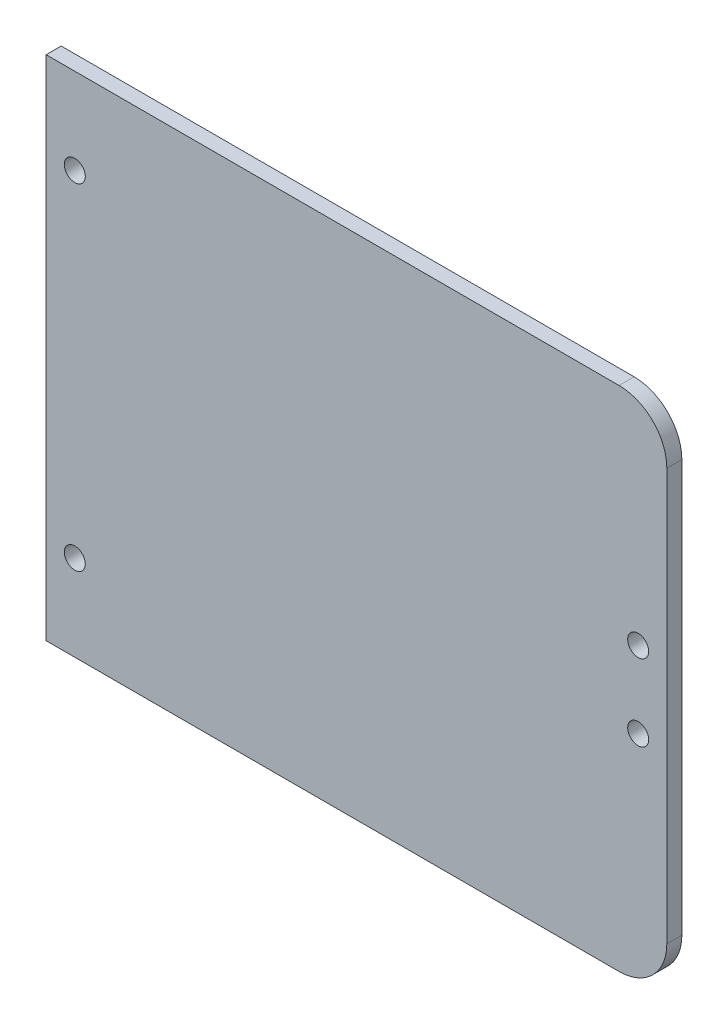
ISO-10303-21;
HEADER;
FILE_DESCRIPTION(('STEP AP214'),'2;1');
FILE_NAME('part.step','',(''),(''),'','','');
FILE_SCHEMA(('AUTOMOTIVE_DESIGN { 1 0 10303 214 1 1 1 1 }'));
ENDSEC;
DATA;
#1=APPLICATION_CONTEXT('core data for automotive mechanical design processes');
#2=APPLICATION_PROTOCOL_DEFINITION('international standard','automotive_design',2000,#1);
#3=PRODUCT_CONTEXT('',#1,'mechanical');
#4=PRODUCT('Part','Part','',(#3));
#5=PRODUCT_RELATED_PRODUCT_CATEGORY('part','',(#4));
#6=PRODUCT_DEFINITION_FORMATION('','',#4);
#7=PRODUCT_DEFINITION_CONTEXT('part definition',#1,'design');
#8=PRODUCT_DEFINITION('design','',#6,#7);
#9=PRODUCT_DEFINITION_SHAPE('','',#8);
#10=(LENGTH_UNIT() NAMED_UNIT(*) SI_UNIT(.MILLI.,.METRE.));
#11=(NAMED_UNIT(*) PLANE_ANGLE_UNIT() SI_UNIT($,.RADIAN.));
#12=(NAMED_UNIT(*) SI_UNIT($,.STERADIAN.) SOLID_ANGLE_UNIT());
#13=UNCERTAINTY_MEASURE_WITH_UNIT(LENGTH_MEASURE(1.E-05),#10,'distance_accuracy_value','');
#14=(GEOMETRIC_REPRESENTATION_CONTEXT(3) GLOBAL_UNCERTAINTY_ASSIGNED_CONTEXT((#13)) GLOBAL_UNIT_ASSIGNED_CONTEXT((#10,
#11,#12)) REPRESENTATION_CONTEXT('',''));
#15=CARTESIAN_POINT('',(0.,0.,0.));
#16=DIRECTION('',(0.,0.,1.));
#17=DIRECTION('',(1.,0.,0.));
#18=AXIS2_PLACEMENT_3D('',#15,#16,#17);
#19=CARTESIAN_POINT('',(60.,-5.,-1.5748));
#20=DIRECTION('',(0.,0.,1.));
#21=DIRECTION('',(1.,0.,0.));
#22=AXIS2_PLACEMENT_3D('',#19,#20,#21);
#23=CYLINDRICAL_SURFACE('',#22,5.);
#24=CARTESIAN_POINT('',(60.,-5.,0.));
#25=DIRECTION('',(0.,0.,1.));
#26=DIRECTION('',(1.,0.,0.));
#27=AXIS2_PLACEMENT_3D('',#24,#25,#26);
#28=CIRCLE('',#27,5.);
#29=CARTESIAN_POINT('',(65.,-5.,0.));
#30=VERTEX_POINT('',#29);
#31=CARTESIAN_POINT('',(60.,0.,0.));
#32=VERTEX_POINT('',#31);
#33=EDGE_CURVE('E117',#30,#32,#28,.T.);
#34=ORIENTED_EDGE('',*,*,#33,.F.);
#35=DIRECTION('',(0.,0.,1.));
#36=VECTOR('',#35,1.);
#37=CARTESIAN_POINT('',(65.,-5.,-1.5748));
#38=LINE('',#37,#36);
#39=CARTESIAN_POINT('',(65.,-5.,-1.5748));
#40=VERTEX_POINT('',#39);
#41=EDGE_CURVE('E11',#40,#30,#38,.T.);
#42=ORIENTED_EDGE('',*,*,#41,.F.);
#43=CARTESIAN_POINT('',(60.,-5.,-1.5748));
#44=DIRECTION('',(0.,0.,1.));
#45=DIRECTION('',(1.,0.,0.));
#46=AXIS2_PLACEMENT_3D('',#43,#44,#45);
#47=CIRCLE('',#46,5.);
#48=CARTESIAN_POINT('',(60.,0.,-1.5748));
#49=VERTEX_POINT('',#48);
#50=EDGE_CURVE('E132',#40,#49,#47,.T.);
#51=ORIENTED_EDGE('',*,*,#50,.T.);
#52=DIRECTION('',(0.,0.,1.));
#53=VECTOR('',#52,1.);
#54=CARTESIAN_POINT('',(60.,0.,-1.5748));
#55=LINE('',#54,#53);
#56=EDGE_CURVE('E35',#49,#32,#55,.T.);
#57=ORIENTED_EDGE('',*,*,#56,.T.);
#58=EDGE_LOOP('',(#34,#42,#51,#57));
#59=FACE_BOUND('',#58,.T.);
#60=ADVANCED_FACE('F32',(#59),#23,.T.);
#61=CARTESIAN_POINT('',(65.,-5.,-1.5748));
#62=DIRECTION('',(1.,0.,0.));
#63=DIRECTION('',(0.,0.,-1.));
#64=AXIS2_PLACEMENT_3D('',#61,#62,#63);
#65=PLANE('',#64);
#66=DIRECTION('',(0.,1.,0.));
#67=VECTOR('',#66,1.);
#68=CARTESIAN_POINT('',(65.,-5.,0.));
#69=LINE('',#68,#67);
#70=CARTESIAN_POINT('',(65.,-48.15,0.));
#71=VERTEX_POINT('',#70);
#72=EDGE_CURVE('E130',#71,#30,#69,.T.);
#73=ORIENTED_EDGE('',*,*,#72,.F.);
#74=DIRECTION('',(0.,0.,1.));
#75=VECTOR('',#74,1.);
#76=CARTESIAN_POINT('',(65.,-48.15,-1.5748));
#77=LINE('',#76,#75);
#78=CARTESIAN_POINT('',(65.,-48.15,-1.5748));
#79=VERTEX_POINT('',#78);
#80=EDGE_CURVE('E41',#79,#71,#77,.T.);
#81=ORIENTED_EDGE('',*,*,#80,.F.);
#82=DIRECTION('',(0.,1.,0.));
#83=VECTOR('',#82,1.);
#84=CARTESIAN_POINT('',(65.,-5.,-1.5748));
#85=LINE('',#84,#83);
#86=EDGE_CURVE('E107',#79,#40,#85,.T.);
#87=ORIENTED_EDGE('',*,*,#86,.T.);
#88=ORIENTED_EDGE('',*,*,#41,.T.);
#89=EDGE_LOOP('',(#73,#81,#87,#88));
#90=FACE_BOUND('',#89,.T.);
#91=ADVANCED_FACE('F140',(#90),#65,.T.);
#92=CARTESIAN_POINT('',(60.,-48.15,-1.5748));
#93=DIRECTION('',(0.,0.,1.));
#94=DIRECTION('',(1.,0.,0.));
#95=AXIS2_PLACEMENT_3D('',#92,#93,#94);
#96=CYLINDRICAL_SURFACE('',#95,5.);
#97=CARTESIAN_POINT('',(60.,-48.15,0.));
#98=DIRECTION('',(0.,0.,1.));
#99=DIRECTION('',(1.,0.,0.));
#100=AXIS2_PLACEMENT_3D('',#97,#98,#99);
#101=CIRCLE('',#100,5.);
#102=CARTESIAN_POINT('',(60.,-53.15,0.));
#103=VERTEX_POINT('',#102);
#104=EDGE_CURVE('E94',#103,#71,#101,.T.);
#105=ORIENTED_EDGE('',*,*,#104,.F.);
#106=DIRECTION('',(0.,0.,1.));
#107=VECTOR('',#106,1.);
#108=CARTESIAN_POINT('',(60.,-53.15,-1.5748));
#109=LINE('',#108,#107);
#110=CARTESIAN_POINT('',(60.,-53.15,-1.5748));
#111=VERTEX_POINT('',#110);
#112=EDGE_CURVE('E89',#111,#103,#109,.T.);
#113=ORIENTED_EDGE('',*,*,#112,.F.);
#114=CARTESIAN_POINT('',(60.,-48.15,-1.5748));
#115=DIRECTION('',(0.,0.,1.));
#116=DIRECTION('',(1.,0.,0.));
#117=AXIS2_PLACEMENT_3D('',#114,#115,#116);
#118=CIRCLE('',#117,5.);
#119=EDGE_CURVE('E92',#111,#79,#118,.T.);
#120=ORIENTED_EDGE('',*,*,#119,.T.);
#121=ORIENTED_EDGE('',*,*,#80,.T.);
#122=EDGE_LOOP('',(#105,#113,#120,#121));
#123=FACE_BOUND('',#122,.T.);
#124=ADVANCED_FACE('F91',(#123),#96,.T.);
#125=CARTESIAN_POINT('',(60.,-53.15,-1.5748));
#126=DIRECTION('',(0.,-1.,0.));
#127=DIRECTION('',(0.,0.,-1.));
#128=AXIS2_PLACEMENT_3D('',#125,#126,#127);
#129=PLANE('',#128);
#130=DIRECTION('',(1.,0.,0.));
#131=VECTOR('',#130,1.);
#132=CARTESIAN_POINT('',(60.,-53.15,0.));
#133=LINE('',#132,#131);
#134=CARTESIAN_POINT('',(0.,-53.15,0.));
#135=VERTEX_POINT('',#134);
#136=EDGE_CURVE('E127',#135,#103,#133,.T.);
#137=ORIENTED_EDGE('',*,*,#136,.F.);
#138=DIRECTION('',(0.,0.,1.));
#139=VECTOR('',#138,1.);
#140=CARTESIAN_POINT('',(0.,-53.15,-1.5748));
#141=LINE('',#140,#139);
#142=CARTESIAN_POINT('',(0.,-53.15,-1.5748));
#143=VERTEX_POINT('',#142);
#144=EDGE_CURVE('E99',#143,#135,#141,.T.);
#145=ORIENTED_EDGE('',*,*,#144,.F.);
#146=DIRECTION('',(1.,0.,0.));
#147=VECTOR('',#146,1.);
#148=CARTESIAN_POINT('',(60.,-53.15,-1.5748));
#149=LINE('',#148,#147);
#150=EDGE_CURVE('E105',#143,#111,#149,.T.);
#151=ORIENTED_EDGE('',*,*,#150,.T.);
#152=ORIENTED_EDGE('',*,*,#112,.T.);
#153=EDGE_LOOP('',(#137,#145,#151,#152));
#154=FACE_BOUND('',#153,.T.);
#155=ADVANCED_FACE('F109',(#154),#129,.T.);
#156=CARTESIAN_POINT('',(0.,-53.15,-1.5748));
#157=DIRECTION('',(-1.,0.,0.));
#158=DIRECTION('',(0.,0.,1.));
#159=AXIS2_PLACEMENT_3D('',#156,#157,#158);
#160=PLANE('',#159);
#161=DIRECTION('',(0.,-1.,0.));
#162=VECTOR('',#161,1.);
#163=CARTESIAN_POINT('',(0.,-53.15,0.));
#164=LINE('',#163,#162);
#165=CARTESIAN_POINT('',(0.,0.,0.));
#166=VERTEX_POINT('',#165);
#167=EDGE_CURVE('E124',#166,#135,#164,.T.);
#168=ORIENTED_EDGE('',*,*,#167,.F.);
#169=DIRECTION('',(0.,0.,1.));
#170=VECTOR('',#169,1.);
#171=CARTESIAN_POINT('',(0.,0.,-1.5748));
#172=LINE('',#171,#170);
#173=CARTESIAN_POINT('',(0.,0.,-1.5748));
#174=VERTEX_POINT('',#173);
#175=EDGE_CURVE('E135',#174,#166,#172,.T.);
#176=ORIENTED_EDGE('',*,*,#175,.F.);
#177=DIRECTION('',(0.,-1.,0.));
#178=VECTOR('',#177,1.);
#179=CARTESIAN_POINT('',(0.,-53.15,-1.5748));
#180=LINE('',#179,#178);
#181=EDGE_CURVE('E110',#174,#143,#180,.T.);
#182=ORIENTED_EDGE('',*,*,#181,.T.);
#183=ORIENTED_EDGE('',*,*,#144,.T.);
#184=EDGE_LOOP('',(#168,#176,#182,#183));
#185=FACE_BOUND('',#184,.T.);
#186=ADVANCED_FACE('F153',(#185),#160,.T.);
#187=CARTESIAN_POINT('',(0.,0.,-1.5748));
#188=DIRECTION('',(0.,1.,0.));
#189=DIRECTION('',(0.,0.,1.));
#190=AXIS2_PLACEMENT_3D('',#187,#188,#189);
#191=PLANE('',#190);
#192=DIRECTION('',(-1.,0.,0.));
#193=VECTOR('',#192,1.);
#194=CARTESIAN_POINT('',(0.,0.,0.));
#195=LINE('',#194,#193);
#196=EDGE_CURVE('E120',#32,#166,#195,.T.);
#197=ORIENTED_EDGE('',*,*,#196,.F.);
#198=ORIENTED_EDGE('',*,*,#56,.F.);
#199=DIRECTION('',(-1.,0.,0.));
#200=VECTOR('',#199,1.);
#201=CARTESIAN_POINT('',(0.,0.,-1.5748));
#202=LINE('',#201,#200);
#203=EDGE_CURVE('E112',#49,#174,#202,.T.);
#204=ORIENTED_EDGE('',*,*,#203,.T.);
#205=ORIENTED_EDGE('',*,*,#175,.T.);
#206=EDGE_LOOP('',(#197,#198,#204,#205));
#207=FACE_BOUND('',#206,.T.);
#208=ADVANCED_FACE('F137',(#207),#191,.T.);
#209=CARTESIAN_POINT('',(60.,-5.,-1.5748));
#210=DIRECTION('',(0.,0.,1.));
#211=DIRECTION('',(1.,0.,0.));
#212=AXIS2_PLACEMENT_3D('',#209,#210,#211);
#213=PLANE('',#212);
#214=CARTESIAN_POINT('',(62.,-22.575,-1.5748));
#215=DIRECTION('',(0.,0.,1.));
#216=DIRECTION('',(1.,0.,0.));
#217=AXIS2_PLACEMENT_3D('',#214,#215,#216);
#218=CIRCLE('',#217,1.1);
#219=CARTESIAN_POINT('',(63.1,-22.575,-1.5748));
#220=VERTEX_POINT('',#219);
#221=EDGE_CURVE('E187',#220,#220,#218,.T.);
#222=ORIENTED_EDGE('',*,*,#221,.T.);
#223=EDGE_LOOP('',(#222));
#224=FACE_BOUND('',#223,.T.);
#225=CARTESIAN_POINT('',(3.,-9.,-1.5748));
#226=DIRECTION('',(0.,0.,1.));
#227=DIRECTION('',(1.,0.,0.));
#228=AXIS2_PLACEMENT_3D('',#225,#226,#227);
#229=CIRCLE('',#228,1.1);
#230=CARTESIAN_POINT('',(4.1,-9.,-1.5748));
#231=VERTEX_POINT('',#230);
#232=EDGE_CURVE('E195',#231,#231,#229,.T.);
#233=ORIENTED_EDGE('',*,*,#232,.T.);
#234=EDGE_LOOP('',(#233));
#235=FACE_BOUND('',#234,.T.);
#236=CARTESIAN_POINT('',(62.,-30.575,-1.5748));
#237=DIRECTION('',(0.,0.,1.));
#238=DIRECTION('',(1.,0.,0.));
#239=AXIS2_PLACEMENT_3D('',#236,#237,#238);
#240=CIRCLE('',#239,1.1);
#241=CARTESIAN_POINT('',(63.1,-30.575,-1.5748));
#242=VERTEX_POINT('',#241);
#243=EDGE_CURVE('E201',#242,#242,#240,.T.);
#244=ORIENTED_EDGE('',*,*,#243,.T.);
#245=EDGE_LOOP('',(#244));
#246=FACE_BOUND('',#245,.T.);
#247=CARTESIAN_POINT('',(3.,-44.15,-1.5748));
#248=DIRECTION('',(0.,0.,1.));
#249=DIRECTION('',(1.,0.,0.));
#250=AXIS2_PLACEMENT_3D('',#247,#248,#249);
#251=CIRCLE('',#250,1.1);
#252=CARTESIAN_POINT('',(4.1,-44.15,-1.5748));
#253=VERTEX_POINT('',#252);
#254=EDGE_CURVE('E121',#253,#253,#251,.T.);
#255=ORIENTED_EDGE('',*,*,#254,.T.);
#256=EDGE_LOOP('',(#255));
#257=FACE_BOUND('',#256,.T.);
#258=ORIENTED_EDGE('',*,*,#50,.F.);
#259=ORIENTED_EDGE('',*,*,#86,.F.);
#260=ORIENTED_EDGE('',*,*,#119,.F.);
#261=ORIENTED_EDGE('',*,*,#150,.F.);
#262=ORIENTED_EDGE('',*,*,#181,.F.);
#263=ORIENTED_EDGE('',*,*,#203,.F.);
#264=EDGE_LOOP('',(#258,#259,#260,#261,#262,#263));
#265=FACE_BOUND('',#264,.T.);
#266=ADVANCED_FACE('F103',(#224,#235,#246,#257,#265),#213,.F.);
#267=CARTESIAN_POINT('',(60.,-5.,0.));
#268=DIRECTION('',(0.,0.,1.));
#269=DIRECTION('',(1.,0.,0.));
#270=AXIS2_PLACEMENT_3D('',#267,#268,#269);
#271=PLANE('',#270);
#272=CARTESIAN_POINT('',(62.,-22.575,0.));
#273=DIRECTION('',(0.,0.,1.));
#274=DIRECTION('',(1.,0.,0.));
#275=AXIS2_PLACEMENT_3D('',#272,#273,#274);
#276=CIRCLE('',#275,1.1);
#277=CARTESIAN_POINT('',(63.1,-22.575,0.));
#278=VERTEX_POINT('',#277);
#279=EDGE_CURVE('E190',#278,#278,#276,.T.);
#280=ORIENTED_EDGE('',*,*,#279,.F.);
#281=EDGE_LOOP('',(#280));
#282=FACE_BOUND('',#281,.T.);
#283=CARTESIAN_POINT('',(3.,-9.,0.));
#284=DIRECTION('',(0.,0.,1.));
#285=DIRECTION('',(1.,0.,0.));
#286=AXIS2_PLACEMENT_3D('',#283,#284,#285);
#287=CIRCLE('',#286,1.1);
#288=CARTESIAN_POINT('',(4.1,-9.,0.));
#289=VERTEX_POINT('',#288);
#290=EDGE_CURVE('E192',#289,#289,#287,.T.);
#291=ORIENTED_EDGE('',*,*,#290,.F.);
#292=EDGE_LOOP('',(#291));
#293=FACE_BOUND('',#292,.T.);
#294=CARTESIAN_POINT('',(62.,-30.575,0.));
#295=DIRECTION('',(0.,0.,1.));
#296=DIRECTION('',(1.,0.,0.));
#297=AXIS2_PLACEMENT_3D('',#294,#295,#296);
#298=CIRCLE('',#297,1.1);
#299=CARTESIAN_POINT('',(63.1,-30.575,0.));
#300=VERTEX_POINT('',#299);
#301=EDGE_CURVE('E198',#300,#300,#298,.T.);
#302=ORIENTED_EDGE('',*,*,#301,.F.);
#303=EDGE_LOOP('',(#302));
#304=FACE_BOUND('',#303,.T.);
#305=CARTESIAN_POINT('',(3.,-44.15,0.));
#306=DIRECTION('',(0.,0.,1.));
#307=DIRECTION('',(1.,0.,0.));
#308=AXIS2_PLACEMENT_3D('',#305,#306,#307);
#309=CIRCLE('',#308,1.1);
#310=CARTESIAN_POINT('',(4.1,-44.15,0.));
#311=VERTEX_POINT('',#310);
#312=EDGE_CURVE('E204',#311,#311,#309,.T.);
#313=ORIENTED_EDGE('',*,*,#312,.F.);
#314=EDGE_LOOP('',(#313));
#315=FACE_BOUND('',#314,.T.);
#316=ORIENTED_EDGE('',*,*,#33,.T.);
#317=ORIENTED_EDGE('',*,*,#196,.T.);
#318=ORIENTED_EDGE('',*,*,#167,.T.);
#319=ORIENTED_EDGE('',*,*,#136,.T.);
#320=ORIENTED_EDGE('',*,*,#104,.T.);
#321=ORIENTED_EDGE('',*,*,#72,.T.);
#322=EDGE_LOOP('',(#316,#317,#318,#319,#320,#321));
#323=FACE_BOUND('',#322,.T.);
#324=ADVANCED_FACE('F139',(#282,#293,#304,#315,#323),#271,.T.);
#325=CARTESIAN_POINT('',(3.,-44.15,-1.5748));
#326=DIRECTION('',(0.,0.,1.));
#327=DIRECTION('',(1.,0.,0.));
#328=AXIS2_PLACEMENT_3D('',#325,#326,#327);
#329=CYLINDRICAL_SURFACE('',#328,1.1);
#330=ORIENTED_EDGE('',*,*,#254,.F.);
#331=EDGE_LOOP('',(#330));
#332=FACE_BOUND('',#331,.T.);
#333=ORIENTED_EDGE('',*,*,#312,.T.);
#334=EDGE_LOOP('',(#333));
#335=FACE_BOUND('',#334,.T.);
#336=ADVANCED_FACE('F164',(#332,#335),#329,.F.);
#337=CARTESIAN_POINT('',(62.,-30.575,-1.5748));
#338=DIRECTION('',(0.,0.,1.));
#339=DIRECTION('',(1.,0.,0.));
#340=AXIS2_PLACEMENT_3D('',#337,#338,#339);
#341=CYLINDRICAL_SURFACE('',#340,1.1);
#342=ORIENTED_EDGE('',*,*,#243,.F.);
#343=EDGE_LOOP('',(#342));
#344=FACE_BOUND('',#343,.T.);
#345=ORIENTED_EDGE('',*,*,#301,.T.);
#346=EDGE_LOOP('',(#345));
#347=FACE_BOUND('',#346,.T.);
#348=ADVANCED_FACE('F171',(#344,#347),#341,.F.);
#349=CARTESIAN_POINT('',(3.,-9.,-1.5748));
#350=DIRECTION('',(0.,0.,1.));
#351=DIRECTION('',(1.,0.,0.));
#352=AXIS2_PLACEMENT_3D('',#349,#350,#351);
#353=CYLINDRICAL_SURFACE('',#352,1.1);
#354=ORIENTED_EDGE('',*,*,#232,.F.);
#355=EDGE_LOOP('',(#354));
#356=FACE_BOUND('',#355,.T.);
#357=ORIENTED_EDGE('',*,*,#290,.T.);
#358=EDGE_LOOP('',(#357));
#359=FACE_BOUND('',#358,.T.);
#360=ADVANCED_FACE('F175',(#356,#359),#353,.F.);
#361=CARTESIAN_POINT('',(62.,-22.575,-1.5748));
#362=DIRECTION('',(0.,0.,1.));
#363=DIRECTION('',(1.,0.,0.));
#364=AXIS2_PLACEMENT_3D('',#361,#362,#363);
#365=CYLINDRICAL_SURFACE('',#364,1.1);
#366=ORIENTED_EDGE('',*,*,#221,.F.);
#367=EDGE_LOOP('',(#366));
#368=FACE_BOUND('',#367,.T.);
#369=ORIENTED_EDGE('',*,*,#279,.T.);
#370=EDGE_LOOP('',(#369));
#371=FACE_BOUND('',#370,.T.);
#372=ADVANCED_FACE('F179',(#368,#371),#365,.F.);
#373=CLOSED_SHELL('',(#60,#91,#124,#155,#186,#208,#266,#324,#336,#348,#360,#372));
#374=MANIFOLD_SOLID_BREP('B2',#373);
#375=ADVANCED_BREP_SHAPE_REPRESENTATION('',(#18,#374),#14);
#376=SHAPE_DEFINITION_REPRESENTATION(#9,#375);
ENDSEC;
END-ISO-10303-21;
